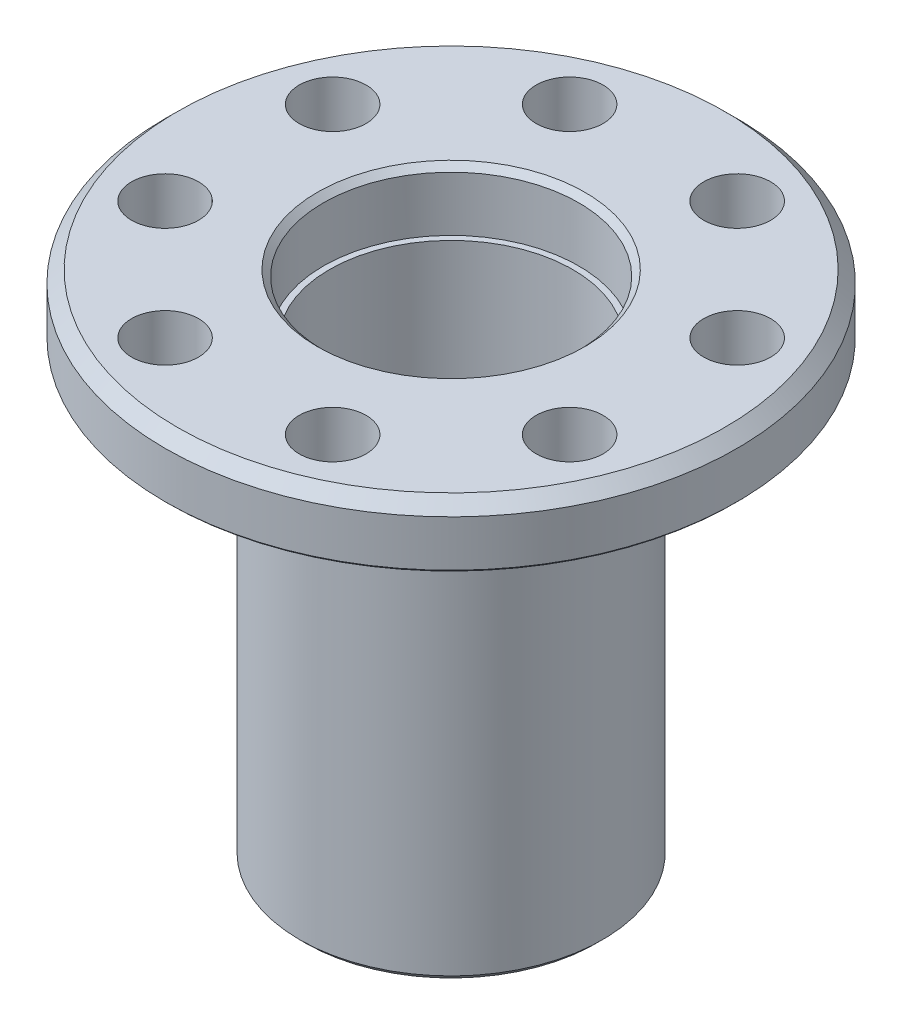
ISO-10303-21;
HEADER;
FILE_DESCRIPTION(('STEP AP214'),'2;1');
FILE_NAME('part.step','',(''),(''),'','','');
FILE_SCHEMA(('AUTOMOTIVE_DESIGN { 1 0 10303 214 1 1 1 1 }'));
ENDSEC;
DATA;
#1=APPLICATION_CONTEXT('core data for automotive mechanical design processes');
#2=APPLICATION_PROTOCOL_DEFINITION('international standard','automotive_design',2000,#1);
#3=PRODUCT_CONTEXT('',#1,'mechanical');
#4=PRODUCT('Part','Part','',(#3));
#5=PRODUCT_RELATED_PRODUCT_CATEGORY('part','',(#4));
#6=PRODUCT_DEFINITION_FORMATION('','',#4);
#7=PRODUCT_DEFINITION_CONTEXT('part definition',#1,'design');
#8=PRODUCT_DEFINITION('design','',#6,#7);
#9=PRODUCT_DEFINITION_SHAPE('','',#8);
#10=(LENGTH_UNIT() NAMED_UNIT(*) SI_UNIT(.MILLI.,.METRE.));
#11=(NAMED_UNIT(*) PLANE_ANGLE_UNIT() SI_UNIT($,.RADIAN.));
#12=(NAMED_UNIT(*) SI_UNIT($,.STERADIAN.) SOLID_ANGLE_UNIT());
#13=UNCERTAINTY_MEASURE_WITH_UNIT(LENGTH_MEASURE(1.E-05),#10,'distance_accuracy_value','');
#14=(GEOMETRIC_REPRESENTATION_CONTEXT(3) GLOBAL_UNCERTAINTY_ASSIGNED_CONTEXT((#13)) GLOBAL_UNIT_ASSIGNED_CONTEXT((#10,
#11,#12)) REPRESENTATION_CONTEXT('',''));
#15=CARTESIAN_POINT('',(0.,0.,0.));
#16=DIRECTION('',(0.,0.,1.));
#17=DIRECTION('',(1.,0.,0.));
#18=AXIS2_PLACEMENT_3D('',#15,#16,#17);
#19=CARTESIAN_POINT('',(16.6298315852,42.,6.888301782572));
#20=DIRECTION('',(0.,-1.,0.));
#21=DIRECTION('',(0.707106781186548,0.,0.707106781186548));
#22=AXIS2_PLACEMENT_3D('',#19,#20,#21);
#23=CYLINDRICAL_SURFACE('',#22,2.75);
#24=CARTESIAN_POINT('',(16.6298315852,42.,6.888301782572));
#25=DIRECTION('',(0.,-1.,0.));
#26=DIRECTION('',(0.707106781186597,0.,0.707106781186498));
#27=AXIS2_PLACEMENT_3D('',#24,#25,#26);
#28=CIRCLE('',#27,2.75);
#29=CARTESIAN_POINT('',(14.685287936937,42.,4.94375813430899));
#30=VERTEX_POINT('',#29);
#31=EDGE_CURVE('E275',#30,#30,#28,.T.);
#32=ORIENTED_EDGE('',*,*,#31,.F.);
#33=DIRECTION('',(0.,-1.,0.));
#34=VECTOR('',#33,1.);
#35=CARTESIAN_POINT('',(14.685287936937,42.,4.94375813430899));
#36=LINE('',#35,#34);
#37=CARTESIAN_POINT('',(14.685287936937,37.,4.94375813430899));
#38=VERTEX_POINT('',#37);
#39=EDGE_CURVE('E11',#30,#38,#36,.T.);
#40=ORIENTED_EDGE('',*,*,#39,.T.);
#41=CARTESIAN_POINT('',(16.6298315852,37.,6.888301782572));
#42=DIRECTION('',(0.,-1.,0.));
#43=DIRECTION('',(0.707106781186597,0.,0.707106781186498));
#44=AXIS2_PLACEMENT_3D('',#41,#42,#43);
#45=CIRCLE('',#44,2.75);
#46=EDGE_CURVE('E216',#38,#38,#45,.T.);
#47=ORIENTED_EDGE('',*,*,#46,.T.);
#48=ORIENTED_EDGE('',*,*,#39,.F.);
#49=EDGE_LOOP('',(#32,#40,#47,#48));
#50=FACE_BOUND('',#49,.T.);
#51=ADVANCED_FACE('F17',(#50),#23,.F.);
#52=CARTESIAN_POINT('',(6.888301782572,42.,16.6298315852));
#53=DIRECTION('',(0.,-1.,0.));
#54=DIRECTION('',(0.,0.,1.));
#55=AXIS2_PLACEMENT_3D('',#52,#53,#54);
#56=CYLINDRICAL_SURFACE('',#55,2.75);
#57=CARTESIAN_POINT('',(6.888301782572,42.,16.6298315852));
#58=DIRECTION('',(0.,-1.,0.));
#59=DIRECTION('',(0.,0.,1.));
#60=AXIS2_PLACEMENT_3D('',#57,#58,#59);
#61=CIRCLE('',#60,2.75);
#62=CARTESIAN_POINT('',(6.888301782572,42.,13.8798315852));
#63=VERTEX_POINT('',#62);
#64=EDGE_CURVE('E209',#63,#63,#61,.T.);
#65=ORIENTED_EDGE('',*,*,#64,.F.);
#66=DIRECTION('',(0.,-1.,0.));
#67=VECTOR('',#66,1.);
#68=CARTESIAN_POINT('',(6.888301782572,42.,13.8798315852));
#69=LINE('',#68,#67);
#70=CARTESIAN_POINT('',(6.888301782572,37.,13.8798315852));
#71=VERTEX_POINT('',#70);
#72=EDGE_CURVE('E28',#63,#71,#69,.T.);
#73=ORIENTED_EDGE('',*,*,#72,.T.);
#74=CARTESIAN_POINT('',(6.888301782572,37.,16.6298315852));
#75=DIRECTION('',(0.,-1.,0.));
#76=DIRECTION('',(0.,0.,1.));
#77=AXIS2_PLACEMENT_3D('',#74,#75,#76);
#78=CIRCLE('',#77,2.75);
#79=EDGE_CURVE('E21',#71,#71,#78,.T.);
#80=ORIENTED_EDGE('',*,*,#79,.T.);
#81=ORIENTED_EDGE('',*,*,#72,.F.);
#82=EDGE_LOOP('',(#65,#73,#80,#81));
#83=FACE_BOUND('',#82,.T.);
#84=ADVANCED_FACE('F455',(#83),#56,.F.);
#85=CARTESIAN_POINT('',(-6.888301782572,42.,16.6298315852));
#86=DIRECTION('',(0.,-1.,0.));
#87=DIRECTION('',(-0.707106781186548,0.,0.707106781186548));
#88=AXIS2_PLACEMENT_3D('',#85,#86,#87);
#89=CYLINDRICAL_SURFACE('',#88,2.75);
#90=CARTESIAN_POINT('',(-6.888301782572,42.,16.6298315852));
#91=DIRECTION('',(0.,-1.,0.));
#92=DIRECTION('',(-0.707106781186548,0.,0.707106781186548));
#93=AXIS2_PLACEMENT_3D('',#90,#91,#92);
#94=CIRCLE('',#93,2.75);
#95=CARTESIAN_POINT('',(-4.94375813430899,42.,14.685287936937));
#96=VERTEX_POINT('',#95);
#97=EDGE_CURVE('E205',#96,#96,#94,.T.);
#98=ORIENTED_EDGE('',*,*,#97,.F.);
#99=DIRECTION('',(0.,-1.,0.));
#100=VECTOR('',#99,1.);
#101=CARTESIAN_POINT('',(-4.94375813430899,42.,14.685287936937));
#102=LINE('',#101,#100);
#103=CARTESIAN_POINT('',(-4.94375813430899,37.,14.685287936937));
#104=VERTEX_POINT('',#103);
#105=EDGE_CURVE('E259',#96,#104,#102,.T.);
#106=ORIENTED_EDGE('',*,*,#105,.T.);
#107=CARTESIAN_POINT('',(-6.888301782572,37.,16.6298315852));
#108=DIRECTION('',(0.,-1.,0.));
#109=DIRECTION('',(-0.707106781186548,0.,0.707106781186548));
#110=AXIS2_PLACEMENT_3D('',#107,#108,#109);
#111=CIRCLE('',#110,2.75);
#112=EDGE_CURVE('E222',#104,#104,#111,.T.);
#113=ORIENTED_EDGE('',*,*,#112,.T.);
#114=ORIENTED_EDGE('',*,*,#105,.F.);
#115=EDGE_LOOP('',(#98,#106,#113,#114));
#116=FACE_BOUND('',#115,.T.);
#117=ADVANCED_FACE('F449',(#116),#89,.F.);
#118=CARTESIAN_POINT('',(-16.6298315852,42.,6.888301782572));
#119=DIRECTION('',(0.,-1.,0.));
#120=DIRECTION('',(-1.,0.,0.));
#121=AXIS2_PLACEMENT_3D('',#118,#119,#120);
#122=CYLINDRICAL_SURFACE('',#121,2.75);
#123=CARTESIAN_POINT('',(-16.6298315852,42.,6.888301782572));
#124=DIRECTION('',(0.,-1.,0.));
#125=DIRECTION('',(-1.,0.,0.));
#126=AXIS2_PLACEMENT_3D('',#123,#124,#125);
#127=CIRCLE('',#126,2.75);
#128=CARTESIAN_POINT('',(-13.8798315852,42.,6.888301782572));
#129=VERTEX_POINT('',#128);
#130=EDGE_CURVE('E210',#129,#129,#127,.T.);
#131=ORIENTED_EDGE('',*,*,#130,.F.);
#132=DIRECTION('',(0.,-1.,0.));
#133=VECTOR('',#132,1.);
#134=CARTESIAN_POINT('',(-13.8798315852,42.,6.888301782572));
#135=LINE('',#134,#133);
#136=CARTESIAN_POINT('',(-13.8798315852,37.,6.888301782572));
#137=VERTEX_POINT('',#136);
#138=EDGE_CURVE('E266',#129,#137,#135,.T.);
#139=ORIENTED_EDGE('',*,*,#138,.T.);
#140=CARTESIAN_POINT('',(-16.6298315852,37.,6.888301782572));
#141=DIRECTION('',(0.,-1.,0.));
#142=DIRECTION('',(-1.,0.,0.));
#143=AXIS2_PLACEMENT_3D('',#140,#141,#142);
#144=CIRCLE('',#143,2.75);
#145=EDGE_CURVE('E226',#137,#137,#144,.T.);
#146=ORIENTED_EDGE('',*,*,#145,.T.);
#147=ORIENTED_EDGE('',*,*,#138,.F.);
#148=EDGE_LOOP('',(#131,#139,#146,#147));
#149=FACE_BOUND('',#148,.T.);
#150=ADVANCED_FACE('F454',(#149),#122,.F.);
#151=CARTESIAN_POINT('',(-16.6298315852,42.,-6.888301782572));
#152=DIRECTION('',(0.,-1.,0.));
#153=DIRECTION('',(-0.707106781186548,0.,-0.707106781186548));
#154=AXIS2_PLACEMENT_3D('',#151,#152,#153);
#155=CYLINDRICAL_SURFACE('',#154,2.75);
#156=CARTESIAN_POINT('',(-16.6298315852,42.,-6.888301782572));
#157=DIRECTION('',(0.,-1.,0.));
#158=DIRECTION('',(-0.707106781186548,0.,-0.707106781186548));
#159=AXIS2_PLACEMENT_3D('',#156,#157,#158);
#160=CIRCLE('',#159,2.75);
#161=CARTESIAN_POINT('',(-14.685287936937,42.,-4.94375813430899));
#162=VERTEX_POINT('',#161);
#163=EDGE_CURVE('E182',#162,#162,#160,.T.);
#164=ORIENTED_EDGE('',*,*,#163,.F.);
#165=DIRECTION('',(0.,-1.,0.));
#166=VECTOR('',#165,1.);
#167=CARTESIAN_POINT('',(-14.685287936937,42.,-4.94375813430899));
#168=LINE('',#167,#166);
#169=CARTESIAN_POINT('',(-14.685287936937,37.,-4.94375813430899));
#170=VERTEX_POINT('',#169);
#171=EDGE_CURVE('E272',#162,#170,#168,.T.);
#172=ORIENTED_EDGE('',*,*,#171,.T.);
#173=CARTESIAN_POINT('',(-16.6298315852,37.,-6.888301782572));
#174=DIRECTION('',(0.,-1.,0.));
#175=DIRECTION('',(-0.707106781186548,0.,-0.707106781186548));
#176=AXIS2_PLACEMENT_3D('',#173,#174,#175);
#177=CIRCLE('',#176,2.75);
#178=EDGE_CURVE('E305',#170,#170,#177,.T.);
#179=ORIENTED_EDGE('',*,*,#178,.T.);
#180=ORIENTED_EDGE('',*,*,#171,.F.);
#181=EDGE_LOOP('',(#164,#172,#179,#180));
#182=FACE_BOUND('',#181,.T.);
#183=ADVANCED_FACE('F472',(#182),#155,.F.);
#184=CARTESIAN_POINT('',(-6.888301782572,42.,-16.6298315852));
#185=DIRECTION('',(0.,-1.,0.));
#186=DIRECTION('',(0.,0.,-1.));
#187=AXIS2_PLACEMENT_3D('',#184,#185,#186);
#188=CYLINDRICAL_SURFACE('',#187,2.75);
#189=CARTESIAN_POINT('',(-6.888301782572,42.,-16.6298315852));
#190=DIRECTION('',(0.,-1.,0.));
#191=DIRECTION('',(0.,0.,-1.));
#192=AXIS2_PLACEMENT_3D('',#189,#190,#191);
#193=CIRCLE('',#192,2.75);
#194=CARTESIAN_POINT('',(-6.888301782572,42.,-13.8798315852));
#195=VERTEX_POINT('',#194);
#196=EDGE_CURVE('E173',#195,#195,#193,.T.);
#197=ORIENTED_EDGE('',*,*,#196,.F.);
#198=DIRECTION('',(0.,-1.,0.));
#199=VECTOR('',#198,1.);
#200=CARTESIAN_POINT('',(-6.888301782572,42.,-13.8798315852));
#201=LINE('',#200,#199);
#202=CARTESIAN_POINT('',(-6.888301782572,37.,-13.8798315852));
#203=VERTEX_POINT('',#202);
#204=EDGE_CURVE('E167',#195,#203,#201,.T.);
#205=ORIENTED_EDGE('',*,*,#204,.T.);
#206=CARTESIAN_POINT('',(-6.888301782572,37.,-16.6298315852));
#207=DIRECTION('',(0.,-1.,0.));
#208=DIRECTION('',(0.,0.,-1.));
#209=AXIS2_PLACEMENT_3D('',#206,#207,#208);
#210=CIRCLE('',#209,2.75);
#211=EDGE_CURVE('E203',#203,#203,#210,.T.);
#212=ORIENTED_EDGE('',*,*,#211,.T.);
#213=ORIENTED_EDGE('',*,*,#204,.F.);
#214=EDGE_LOOP('',(#197,#205,#212,#213));
#215=FACE_BOUND('',#214,.T.);
#216=ADVANCED_FACE('F522',(#215),#188,.F.);
#217=CARTESIAN_POINT('',(6.888301782572,42.,-16.6298315852));
#218=DIRECTION('',(0.,-1.,0.));
#219=DIRECTION('',(0.707106781186548,0.,-0.707106781186548));
#220=AXIS2_PLACEMENT_3D('',#217,#218,#219);
#221=CYLINDRICAL_SURFACE('',#220,2.75);
#222=CARTESIAN_POINT('',(6.888301782572,42.,-16.6298315852));
#223=DIRECTION('',(0.,-1.,0.));
#224=DIRECTION('',(0.707106781186548,0.,-0.707106781186548));
#225=AXIS2_PLACEMENT_3D('',#222,#223,#224);
#226=CIRCLE('',#225,2.75);
#227=CARTESIAN_POINT('',(4.94375813430899,42.,-14.685287936937));
#228=VERTEX_POINT('',#227);
#229=EDGE_CURVE('E163',#228,#228,#226,.T.);
#230=ORIENTED_EDGE('',*,*,#229,.F.);
#231=DIRECTION('',(0.,-1.,0.));
#232=VECTOR('',#231,1.);
#233=CARTESIAN_POINT('',(4.94375813430899,42.,-14.685287936937));
#234=LINE('',#233,#232);
#235=CARTESIAN_POINT('',(4.94375813430899,37.,-14.685287936937));
#236=VERTEX_POINT('',#235);
#237=EDGE_CURVE('E160',#228,#236,#234,.T.);
#238=ORIENTED_EDGE('',*,*,#237,.T.);
#239=CARTESIAN_POINT('',(6.888301782572,37.,-16.6298315852));
#240=DIRECTION('',(0.,-1.,0.));
#241=DIRECTION('',(0.707106781186548,0.,-0.707106781186548));
#242=AXIS2_PLACEMENT_3D('',#239,#240,#241);
#243=CIRCLE('',#242,2.75);
#244=EDGE_CURVE('E165',#236,#236,#243,.T.);
#245=ORIENTED_EDGE('',*,*,#244,.T.);
#246=ORIENTED_EDGE('',*,*,#237,.F.);
#247=EDGE_LOOP('',(#230,#238,#245,#246));
#248=FACE_BOUND('',#247,.T.);
#249=ADVANCED_FACE('F162',(#248),#221,.F.);
#250=CARTESIAN_POINT('',(16.6298315852,42.,-6.888301782572));
#251=DIRECTION('',(0.,-1.,0.));
#252=DIRECTION('',(1.,0.,0.));
#253=AXIS2_PLACEMENT_3D('',#250,#251,#252);
#254=CYLINDRICAL_SURFACE('',#253,2.75);
#255=CARTESIAN_POINT('',(16.6298315852,42.,-6.888301782572));
#256=DIRECTION('',(0.,-1.,0.));
#257=DIRECTION('',(1.,0.,0.));
#258=AXIS2_PLACEMENT_3D('',#255,#256,#257);
#259=CIRCLE('',#258,2.75);
#260=CARTESIAN_POINT('',(13.8798315852,42.,-6.888301782572));
#261=VERTEX_POINT('',#260);
#262=EDGE_CURVE('E174',#261,#261,#259,.T.);
#263=ORIENTED_EDGE('',*,*,#262,.F.);
#264=DIRECTION('',(0.,-1.,0.));
#265=VECTOR('',#264,1.);
#266=CARTESIAN_POINT('',(13.8798315852,42.,-6.888301782572));
#267=LINE('',#266,#265);
#268=CARTESIAN_POINT('',(13.8798315852,37.,-6.888301782572));
#269=VERTEX_POINT('',#268);
#270=EDGE_CURVE('E152',#261,#269,#267,.T.);
#271=ORIENTED_EDGE('',*,*,#270,.T.);
#272=CARTESIAN_POINT('',(16.6298315852,37.,-6.888301782572));
#273=DIRECTION('',(0.,-1.,0.));
#274=DIRECTION('',(1.,0.,0.));
#275=AXIS2_PLACEMENT_3D('',#272,#273,#274);
#276=CIRCLE('',#275,2.75);
#277=EDGE_CURVE('E204',#269,#269,#276,.T.);
#278=ORIENTED_EDGE('',*,*,#277,.T.);
#279=ORIENTED_EDGE('',*,*,#270,.F.);
#280=EDGE_LOOP('',(#263,#271,#278,#279));
#281=FACE_BOUND('',#280,.T.);
#282=ADVANCED_FACE('F434',(#281),#254,.F.);
#283=CARTESIAN_POINT('',(0.,4.,0.));
#284=DIRECTION('',(0.,1.,0.));
#285=DIRECTION('',(1.,0.,0.));
#286=AXIS2_PLACEMENT_3D('',#283,#284,#285);
#287=PLANE('',#286);
#288=CARTESIAN_POINT('',(0.,4.,0.));
#289=DIRECTION('',(0.,-1.,0.));
#290=DIRECTION('',(0.,0.,-1.));
#291=AXIS2_PLACEMENT_3D('',#288,#289,#290);
#292=CIRCLE('',#291,8.99997188415259);
#293=CARTESIAN_POINT('',(0.,4.,8.99997188415259));
#294=VERTEX_POINT('',#293);
#295=EDGE_CURVE('E337',#294,#294,#292,.T.);
#296=ORIENTED_EDGE('',*,*,#295,.F.);
#297=EDGE_LOOP('',(#296));
#298=FACE_BOUND('',#297,.T.);
#299=ADVANCED_FACE('F428',(#298),#287,.T.);
#300=CARTESIAN_POINT('',(0.,4.500016355929,0.));
#301=DIRECTION('',(0.,1.,0.));
#302=DIRECTION('',(0.,0.,-1.));
#303=AXIS2_PLACEMENT_3D('',#300,#301,#302);
#304=CONICAL_SURFACE('',#303,9.499986678039,0.785396601403516);
#305=ORIENTED_EDGE('',*,*,#295,.T.);
#306=DIRECTION('',(0.,0.707107885682187,0.707105676689183));
#307=VECTOR('',#306,1.);
#308=CARTESIAN_POINT('',(0.,4.500016355929,9.499986678039));
#309=LINE('',#308,#307);
#310=CARTESIAN_POINT('',(0.,5.000031239928,10.));
#311=VERTEX_POINT('',#310);
#312=EDGE_CURVE('E42',#294,#311,#309,.T.);
#313=ORIENTED_EDGE('',*,*,#312,.T.);
#314=CARTESIAN_POINT('',(0.,5.00003123992799,0.));
#315=DIRECTION('',(0.,-1.,0.));
#316=DIRECTION('',(1.,0.,0.));
#317=AXIS2_PLACEMENT_3D('',#314,#315,#316);
#318=CIRCLE('',#317,10.);
#319=CARTESIAN_POINT('',(-10.,5.00003123992799,0.));
#320=VERTEX_POINT('',#319);
#321=EDGE_CURVE('E200',#320,#311,#318,.T.);
#322=ORIENTED_EDGE('',*,*,#321,.F.);
#323=CARTESIAN_POINT('',(0.,5.00003123992799,0.));
#324=DIRECTION('',(0.,-1.,0.));
#325=DIRECTION('',(1.,0.,0.));
#326=AXIS2_PLACEMENT_3D('',#323,#324,#325);
#327=CIRCLE('',#326,10.);
#328=EDGE_CURVE('E195',#311,#320,#327,.T.);
#329=ORIENTED_EDGE('',*,*,#328,.F.);
#330=ORIENTED_EDGE('',*,*,#312,.F.);
#331=EDGE_LOOP('',(#305,#313,#322,#329,#330));
#332=FACE_BOUND('',#331,.T.);
#333=ADVANCED_FACE('F433',(#332),#304,.F.);
#334=CARTESIAN_POINT('',(0.,-2.1,0.));
#335=DIRECTION('',(0.,1.,0.));
#336=DIRECTION('',(1.,0.,0.));
#337=AXIS2_PLACEMENT_3D('',#334,#335,#336);
#338=CYLINDRICAL_SURFACE('',#337,10.);
#339=ORIENTED_EDGE('',*,*,#321,.T.);
#340=ORIENTED_EDGE('',*,*,#328,.T.);
#341=DIRECTION('',(0.,1.,0.));
#342=VECTOR('',#341,1.);
#343=CARTESIAN_POINT('',(-10.,-2.1,0.));
#344=LINE('',#343,#342);
#345=CARTESIAN_POINT('',(-10.,37.,0.));
#346=VERTEX_POINT('',#345);
#347=EDGE_CURVE('E199',#320,#346,#344,.T.);
#348=ORIENTED_EDGE('',*,*,#347,.T.);
#349=CARTESIAN_POINT('',(0.,37.,0.));
#350=DIRECTION('',(0.,1.,0.));
#351=DIRECTION('',(1.,0.,0.));
#352=AXIS2_PLACEMENT_3D('',#349,#350,#351);
#353=CIRCLE('',#352,10.);
#354=EDGE_CURVE('E217',#346,#346,#353,.T.);
#355=ORIENTED_EDGE('',*,*,#354,.T.);
#356=ORIENTED_EDGE('',*,*,#347,.F.);
#357=EDGE_LOOP('',(#339,#340,#348,#355,#356));
#358=FACE_BOUND('',#357,.T.);
#359=ADVANCED_FACE('F489',(#358),#338,.F.);
#360=CARTESIAN_POINT('',(0.,37.,0.));
#361=DIRECTION('',(0.,1.,0.));
#362=DIRECTION('',(1.,0.,0.));
#363=AXIS2_PLACEMENT_3D('',#360,#361,#362);
#364=PLANE('',#363);
#365=ORIENTED_EDGE('',*,*,#354,.F.);
#366=EDGE_LOOP('',(#365));
#367=FACE_BOUND('',#366,.T.);
#368=CARTESIAN_POINT('',(0.,37.,0.));
#369=DIRECTION('',(0.,-1.,0.));
#370=DIRECTION('',(1.,0.,0.));
#371=AXIS2_PLACEMENT_3D('',#368,#369,#370);
#372=CIRCLE('',#371,10.5);
#373=CARTESIAN_POINT('',(-10.5,37.,0.));
#374=VERTEX_POINT('',#373);
#375=EDGE_CURVE('E232',#374,#374,#372,.T.);
#376=ORIENTED_EDGE('',*,*,#375,.F.);
#377=EDGE_LOOP('',(#376));
#378=FACE_BOUND('',#377,.T.);
#379=ADVANCED_FACE('F481',(#367,#378),#364,.T.);
#380=CARTESIAN_POINT('',(0.,-2.1,0.));
#381=DIRECTION('',(0.,1.,0.));
#382=DIRECTION('',(1.,0.,0.));
#383=AXIS2_PLACEMENT_3D('',#380,#381,#382);
#384=CYLINDRICAL_SURFACE('',#383,10.5);
#385=ORIENTED_EDGE('',*,*,#375,.T.);
#386=DIRECTION('',(0.,1.,0.));
#387=VECTOR('',#386,1.);
#388=CARTESIAN_POINT('',(-10.5,-2.1,0.));
#389=LINE('',#388,#387);
#390=CARTESIAN_POINT('',(-10.5,41.500009792197,0.));
#391=VERTEX_POINT('',#390);
#392=EDGE_CURVE('E221',#374,#391,#389,.T.);
#393=ORIENTED_EDGE('',*,*,#392,.T.);
#394=CARTESIAN_POINT('',(0.,41.500009792197,0.));
#395=DIRECTION('',(0.,1.,0.));
#396=DIRECTION('',(1.,0.,0.));
#397=AXIS2_PLACEMENT_3D('',#394,#395,#396);
#398=CIRCLE('',#397,10.5);
#399=CARTESIAN_POINT('',(0.,41.5000097921969,10.5));
#400=VERTEX_POINT('',#399);
#401=EDGE_CURVE('E235',#391,#400,#398,.T.);
#402=ORIENTED_EDGE('',*,*,#401,.T.);
#403=CARTESIAN_POINT('',(0.,41.500009792197,0.));
#404=DIRECTION('',(0.,1.,0.));
#405=DIRECTION('',(1.,0.,0.));
#406=AXIS2_PLACEMENT_3D('',#403,#404,#405);
#407=CIRCLE('',#406,10.5);
#408=EDGE_CURVE('E252',#400,#391,#407,.T.);
#409=ORIENTED_EDGE('',*,*,#408,.T.);
#410=ORIENTED_EDGE('',*,*,#392,.F.);
#411=EDGE_LOOP('',(#385,#393,#402,#409,#410));
#412=FACE_BOUND('',#411,.T.);
#413=ADVANCED_FACE('F360',(#412),#384,.F.);
#414=CARTESIAN_POINT('',(0.,41.75000514855,0.));
#415=DIRECTION('',(0.,1.,0.));
#416=DIRECTION('',(0.,0.,-1.));
#417=AXIS2_PLACEMENT_3D('',#414,#415,#416);
#418=CONICAL_SURFACE('',#417,10.74999512321,0.785397697102544);
#419=ORIENTED_EDGE('',*,*,#408,.F.);
#420=DIRECTION('',(0.,0.707107110906759,0.707106451466182));
#421=VECTOR('',#420,1.);
#422=CARTESIAN_POINT('',(0.,41.75000514855,10.74999512321));
#423=LINE('',#422,#421);
#424=CARTESIAN_POINT('',(0.,42.,10.9999897415174));
#425=VERTEX_POINT('',#424);
#426=EDGE_CURVE('E244',#400,#425,#423,.T.);
#427=ORIENTED_EDGE('',*,*,#426,.T.);
#428=CARTESIAN_POINT('',(0.,42.,0.));
#429=DIRECTION('',(0.,1.,0.));
#430=DIRECTION('',(0.,0.,-1.));
#431=AXIS2_PLACEMENT_3D('',#428,#429,#430);
#432=CIRCLE('',#431,10.9999897415175);
#433=EDGE_CURVE('E184',#425,#425,#432,.T.);
#434=ORIENTED_EDGE('',*,*,#433,.T.);
#435=ORIENTED_EDGE('',*,*,#426,.F.);
#436=ORIENTED_EDGE('',*,*,#401,.F.);
#437=EDGE_LOOP('',(#419,#427,#434,#435,#436));
#438=FACE_BOUND('',#437,.T.);
#439=ADVANCED_FACE('F362',(#438),#418,.F.);
#440=CARTESIAN_POINT('',(0.,42.,0.));
#441=DIRECTION('',(0.,1.,0.));
#442=DIRECTION('',(1.,0.,0.));
#443=AXIS2_PLACEMENT_3D('',#440,#441,#442);
#444=PLANE('',#443);
#445=ORIENTED_EDGE('',*,*,#31,.T.);
#446=EDGE_LOOP('',(#445));
#447=FACE_BOUND('',#446,.T.);
#448=ORIENTED_EDGE('',*,*,#64,.T.);
#449=EDGE_LOOP('',(#448));
#450=FACE_BOUND('',#449,.T.);
#451=ORIENTED_EDGE('',*,*,#97,.T.);
#452=EDGE_LOOP('',(#451));
#453=FACE_BOUND('',#452,.T.);
#454=ORIENTED_EDGE('',*,*,#130,.T.);
#455=EDGE_LOOP('',(#454));
#456=FACE_BOUND('',#455,.T.);
#457=ORIENTED_EDGE('',*,*,#163,.T.);
#458=EDGE_LOOP('',(#457));
#459=FACE_BOUND('',#458,.T.);
#460=ORIENTED_EDGE('',*,*,#196,.T.);
#461=EDGE_LOOP('',(#460));
#462=FACE_BOUND('',#461,.T.);
#463=ORIENTED_EDGE('',*,*,#229,.T.);
#464=EDGE_LOOP('',(#463));
#465=FACE_BOUND('',#464,.T.);
#466=ORIENTED_EDGE('',*,*,#262,.T.);
#467=EDGE_LOOP('',(#466));
#468=FACE_BOUND('',#467,.T.);
#469=ORIENTED_EDGE('',*,*,#433,.F.);
#470=EDGE_LOOP('',(#469));
#471=FACE_BOUND('',#470,.T.);
#472=CARTESIAN_POINT('',(0.,42.00000241433,0.));
#473=DIRECTION('',(0.,1.,0.));
#474=DIRECTION('',(1.,0.,0.));
#475=AXIS2_PLACEMENT_3D('',#472,#473,#474);
#476=CIRCLE('',#475,22.49999987973);
#477=CARTESIAN_POINT('',(0.,42.0000024143303,22.4999998797304));
#478=VERTEX_POINT('',#477);
#479=EDGE_CURVE('E193',#478,#478,#476,.T.);
#480=ORIENTED_EDGE('',*,*,#479,.T.);
#481=EDGE_LOOP('',(#480));
#482=FACE_BOUND('',#481,.T.);
#483=ADVANCED_FACE('F170',(#447,#450,#453,#456,#459,#462,#465,#468,#471,#482),#444,.T.);
#484=CARTESIAN_POINT('',(0.,41.50000068628,0.));
#485=DIRECTION('',(0.,-1.,0.));
#486=DIRECTION('',(0.,0.,-1.));
#487=AXIS2_PLACEMENT_3D('',#484,#485,#486);
#488=CONICAL_SURFACE('',#487,23.00000165876,0.785398214376596);
#489=CARTESIAN_POINT('',(0.,41.000002396019,0.));
#490=DIRECTION('',(0.,1.,0.));
#491=DIRECTION('',(1.,0.,0.));
#492=AXIS2_PLACEMENT_3D('',#489,#490,#491);
#493=CIRCLE('',#492,23.5);
#494=CARTESIAN_POINT('',(-23.5,41.000002396019,0.));
#495=VERTEX_POINT('',#494);
#496=CARTESIAN_POINT('',(0.,41.000002396019,23.5));
#497=VERTEX_POINT('',#496);
#498=EDGE_CURVE('E301',#495,#497,#493,.T.);
#499=ORIENTED_EDGE('',*,*,#498,.T.);
#500=DIRECTION('',(0.,0.707106745138846,-0.707106817234248));
#501=VECTOR('',#500,1.);
#502=CARTESIAN_POINT('',(0.,41.50000068628,23.00000165876));
#503=LINE('',#502,#501);
#504=EDGE_CURVE('E189',#497,#478,#503,.T.);
#505=ORIENTED_EDGE('',*,*,#504,.T.);
#506=ORIENTED_EDGE('',*,*,#479,.F.);
#507=ORIENTED_EDGE('',*,*,#504,.F.);
#508=CARTESIAN_POINT('',(0.,41.000002396019,0.));
#509=DIRECTION('',(0.,1.,0.));
#510=DIRECTION('',(1.,0.,0.));
#511=AXIS2_PLACEMENT_3D('',#508,#509,#510);
#512=CIRCLE('',#511,23.5);
#513=EDGE_CURVE('E194',#497,#495,#512,.T.);
#514=ORIENTED_EDGE('',*,*,#513,.T.);
#515=EDGE_LOOP('',(#499,#505,#506,#507,#514));
#516=FACE_BOUND('',#515,.T.);
#517=ADVANCED_FACE('F367',(#516),#488,.T.);
#518=CARTESIAN_POINT('',(0.,-2.1,0.));
#519=DIRECTION('',(0.,1.,0.));
#520=DIRECTION('',(1.,0.,0.));
#521=AXIS2_PLACEMENT_3D('',#518,#519,#520);
#522=CYLINDRICAL_SURFACE('',#521,23.5);
#523=ORIENTED_EDGE('',*,*,#498,.F.);
#524=DIRECTION('',(0.,-1.,0.));
#525=VECTOR('',#524,1.);
#526=CARTESIAN_POINT('',(-23.5,-2.1,0.));
#527=LINE('',#526,#525);
#528=CARTESIAN_POINT('',(-23.5,37.20000203191,0.));
#529=VERTEX_POINT('',#528);
#530=EDGE_CURVE('E297',#495,#529,#527,.T.);
#531=ORIENTED_EDGE('',*,*,#530,.T.);
#532=CARTESIAN_POINT('',(0.,37.20000203191,0.));
#533=DIRECTION('',(0.,1.,0.));
#534=DIRECTION('',(1.,0.,0.));
#535=AXIS2_PLACEMENT_3D('',#532,#533,#534);
#536=CIRCLE('',#535,23.5);
#537=CARTESIAN_POINT('',(0.,37.2000022778398,23.4999997540702));
#538=VERTEX_POINT('',#537);
#539=EDGE_CURVE('E211',#529,#538,#536,.T.);
#540=ORIENTED_EDGE('',*,*,#539,.T.);
#541=CARTESIAN_POINT('',(0.,37.20000203191,0.));
#542=DIRECTION('',(0.,1.,0.));
#543=DIRECTION('',(1.,0.,0.));
#544=AXIS2_PLACEMENT_3D('',#541,#542,#543);
#545=CIRCLE('',#544,23.5);
#546=EDGE_CURVE('E215',#538,#529,#545,.T.);
#547=ORIENTED_EDGE('',*,*,#546,.T.);
#548=ORIENTED_EDGE('',*,*,#530,.F.);
#549=ORIENTED_EDGE('',*,*,#513,.F.);
#550=EDGE_LOOP('',(#523,#531,#540,#547,#548,#549));
#551=FACE_BOUND('',#550,.T.);
#552=ADVANCED_FACE('F379',(#551),#522,.T.);
#553=CARTESIAN_POINT('',(0.,37.10000137248,-1.27453603227E-13));
#554=DIRECTION('',(0.,1.,0.));
#555=DIRECTION('',(0.,0.,-1.));
#556=AXIS2_PLACEMENT_3D('',#553,#554,#555);
#557=CONICAL_SURFACE('',#556,23.39999885945,0.7853981097003);
#558=ORIENTED_EDGE('',*,*,#539,.F.);
#559=ORIENTED_EDGE('',*,*,#546,.F.);
#560=DIRECTION('',(0.,-0.707106819156165,-0.707106743216928));
#561=VECTOR('',#560,1.);
#562=CARTESIAN_POINT('',(0.,37.10000137248,23.3999988594499));
#563=LINE('',#562,#561);
#564=CARTESIAN_POINT('',(0.,37.0000002529352,23.2999977506446));
#565=VERTEX_POINT('',#564);
#566=EDGE_CURVE('E255',#538,#565,#563,.T.);
#567=ORIENTED_EDGE('',*,*,#566,.T.);
#568=CARTESIAN_POINT('',(0.,37.00000025293,-1.27453603227E-13));
#569=DIRECTION('',(0.,1.,0.));
#570=DIRECTION('',(1.,0.,0.));
#571=AXIS2_PLACEMENT_3D('',#568,#569,#570);
#572=CIRCLE('',#571,23.29999775065);
#573=EDGE_CURVE('E289',#565,#565,#572,.T.);
#574=ORIENTED_EDGE('',*,*,#573,.T.);
#575=ORIENTED_EDGE('',*,*,#566,.F.);
#576=EDGE_LOOP('',(#558,#559,#567,#574,#575));
#577=FACE_BOUND('',#576,.T.);
#578=ADVANCED_FACE('F497',(#577),#557,.T.);
#579=CARTESIAN_POINT('',(0.,37.,0.));
#580=DIRECTION('',(0.,1.,0.));
#581=DIRECTION('',(1.,0.,0.));
#582=AXIS2_PLACEMENT_3D('',#579,#580,#581);
#583=PLANE('',#582);
#584=ORIENTED_EDGE('',*,*,#46,.F.);
#585=EDGE_LOOP('',(#584));
#586=FACE_BOUND('',#585,.T.);
#587=ORIENTED_EDGE('',*,*,#79,.F.);
#588=EDGE_LOOP('',(#587));
#589=FACE_BOUND('',#588,.T.);
#590=ORIENTED_EDGE('',*,*,#112,.F.);
#591=EDGE_LOOP('',(#590));
#592=FACE_BOUND('',#591,.T.);
#593=ORIENTED_EDGE('',*,*,#145,.F.);
#594=EDGE_LOOP('',(#593));
#595=FACE_BOUND('',#594,.T.);
#596=ORIENTED_EDGE('',*,*,#178,.F.);
#597=EDGE_LOOP('',(#596));
#598=FACE_BOUND('',#597,.T.);
#599=ORIENTED_EDGE('',*,*,#211,.F.);
#600=EDGE_LOOP('',(#599));
#601=FACE_BOUND('',#600,.T.);
#602=ORIENTED_EDGE('',*,*,#244,.F.);
#603=EDGE_LOOP('',(#602));
#604=FACE_BOUND('',#603,.T.);
#605=ORIENTED_EDGE('',*,*,#277,.F.);
#606=EDGE_LOOP('',(#605));
#607=FACE_BOUND('',#606,.T.);
#608=CARTESIAN_POINT('',(0.,37.,0.));
#609=DIRECTION('',(0.,1.,0.));
#610=DIRECTION('',(1.,0.,0.));
#611=AXIS2_PLACEMENT_3D('',#608,#609,#610);
#612=CIRCLE('',#611,12.45);
#613=CARTESIAN_POINT('',(-12.45,37.,0.));
#614=VERTEX_POINT('',#613);
#615=EDGE_CURVE('E279',#614,#614,#612,.T.);
#616=ORIENTED_EDGE('',*,*,#615,.T.);
#617=EDGE_LOOP('',(#616));
#618=FACE_BOUND('',#617,.T.);
#619=ORIENTED_EDGE('',*,*,#573,.F.);
#620=EDGE_LOOP('',(#619));
#621=FACE_BOUND('',#620,.T.);
#622=ADVANCED_FACE('F405',(#586,#589,#592,#595,#598,#601,#604,#607,#618,#621),#583,.F.);
#623=CARTESIAN_POINT('',(0.,-2.1,0.));
#624=DIRECTION('',(0.,1.,0.));
#625=DIRECTION('',(1.,0.,0.));
#626=AXIS2_PLACEMENT_3D('',#623,#624,#625);
#627=CYLINDRICAL_SURFACE('',#626,12.45);
#628=ORIENTED_EDGE('',*,*,#615,.F.);
#629=DIRECTION('',(0.,-1.,0.));
#630=VECTOR('',#629,1.);
#631=CARTESIAN_POINT('',(-12.45,-2.1,0.));
#632=LINE('',#631,#630);
#633=CARTESIAN_POINT('',(-12.45,0.500011269634449,0.));
#634=VERTEX_POINT('',#633);
#635=EDGE_CURVE('E283',#614,#634,#632,.T.);
#636=ORIENTED_EDGE('',*,*,#635,.T.);
#637=CARTESIAN_POINT('',(0.,0.500011269634449,0.));
#638=DIRECTION('',(0.,1.,0.));
#639=DIRECTION('',(1.,0.,0.));
#640=AXIS2_PLACEMENT_3D('',#637,#638,#639);
#641=CIRCLE('',#640,12.45);
#642=CARTESIAN_POINT('',(0.,0.500011269634465,12.45));
#643=VERTEX_POINT('',#642);
#644=EDGE_CURVE('E231',#634,#643,#641,.T.);
#645=ORIENTED_EDGE('',*,*,#644,.T.);
#646=CARTESIAN_POINT('',(0.,0.500011269634449,0.));
#647=DIRECTION('',(0.,1.,0.));
#648=DIRECTION('',(1.,0.,0.));
#649=AXIS2_PLACEMENT_3D('',#646,#647,#648);
#650=CIRCLE('',#649,12.45);
#651=EDGE_CURVE('E227',#643,#634,#650,.T.);
#652=ORIENTED_EDGE('',*,*,#651,.T.);
#653=ORIENTED_EDGE('',*,*,#635,.F.);
#654=EDGE_LOOP('',(#628,#636,#645,#652,#653));
#655=FACE_BOUND('',#654,.T.);
#656=ADVANCED_FACE('F19',(#655),#627,.T.);
#657=CARTESIAN_POINT('',(0.,0.2500060699422,0.));
#658=DIRECTION('',(0.,1.,0.));
#659=DIRECTION('',(0.,0.,-1.));
#660=AXIS2_PLACEMENT_3D('',#657,#658,#659);
#661=CONICAL_SURFACE('',#660,12.19999502661,0.785397710802157);
#662=ORIENTED_EDGE('',*,*,#644,.F.);
#663=ORIENTED_EDGE('',*,*,#651,.F.);
#664=DIRECTION('',(0.,-0.707107101219675,-0.707106461153276));
#665=VECTOR('',#664,1.);
#666=CARTESIAN_POINT('',(0.,0.2500060699422,12.19999502661));
#667=LINE('',#666,#665);
#668=CARTESIAN_POINT('',(0.,0.,11.9499891829708));
#669=VERTEX_POINT('',#668);
#670=EDGE_CURVE('E230',#643,#669,#667,.T.);
#671=ORIENTED_EDGE('',*,*,#670,.T.);
#672=CARTESIAN_POINT('',(0.,0.,0.));
#673=DIRECTION('',(0.,1.,0.));
#674=DIRECTION('',(0.,0.,-1.));
#675=AXIS2_PLACEMENT_3D('',#672,#673,#674);
#676=CIRCLE('',#675,11.9499891829708);
#677=EDGE_CURVE('E296',#669,#669,#676,.T.);
#678=ORIENTED_EDGE('',*,*,#677,.T.);
#679=ORIENTED_EDGE('',*,*,#670,.F.);
#680=EDGE_LOOP('',(#662,#663,#671,#678,#679));
#681=FACE_BOUND('',#680,.T.);
#682=ADVANCED_FACE('F404',(#681),#661,.T.);
#683=CARTESIAN_POINT('',(0.,0.,0.));
#684=DIRECTION('',(0.,1.,0.));
#685=DIRECTION('',(1.,0.,0.));
#686=AXIS2_PLACEMENT_3D('',#683,#684,#685);
#687=PLANE('',#686);
#688=ORIENTED_EDGE('',*,*,#677,.F.);
#689=EDGE_LOOP('',(#688));
#690=FACE_BOUND('',#689,.T.);
#691=ADVANCED_FACE('F414',(#690),#687,.F.);
#692=CLOSED_SHELL('',(#51,#84,#117,#150,#183,#216,#249,#282,#299,#333,#359,#379,#413,#439,#483,
#517,#552,#578,#622,#656,#682,#691));
#693=MANIFOLD_SOLID_BREP('B1',#692);
#694=ADVANCED_BREP_SHAPE_REPRESENTATION('',(#18,#693),#14);
#695=SHAPE_DEFINITION_REPRESENTATION(#9,#694);
ENDSEC;
END-ISO-10303-21;
